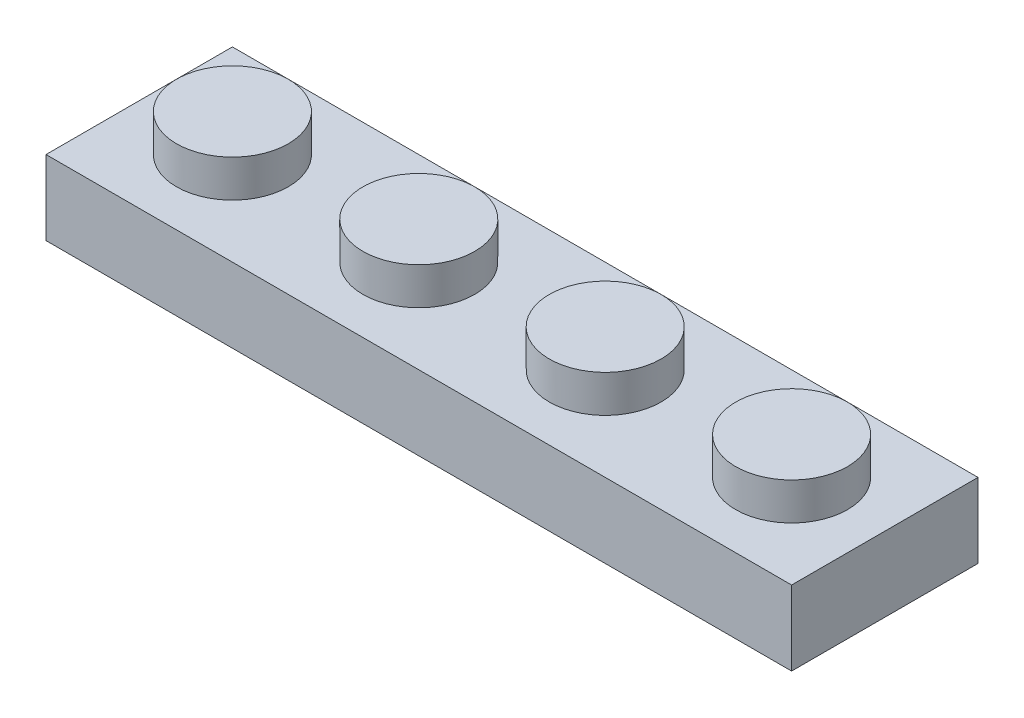
ISO-10303-21;
HEADER;
FILE_DESCRIPTION(('STEP AP214'),'2;1');
FILE_NAME('part.step','',(''),(''),'','','');
FILE_SCHEMA(('AUTOMOTIVE_DESIGN { 1 0 10303 214 1 1 1 1 }'));
ENDSEC;
DATA;
#1=APPLICATION_CONTEXT('core data for automotive mechanical design processes');
#2=APPLICATION_PROTOCOL_DEFINITION('international standard','automotive_design',2000,#1);
#3=PRODUCT_CONTEXT('',#1,'mechanical');
#4=PRODUCT('Part','Part','',(#3));
#5=PRODUCT_RELATED_PRODUCT_CATEGORY('part','',(#4));
#6=PRODUCT_DEFINITION_FORMATION('','',#4);
#7=PRODUCT_DEFINITION_CONTEXT('part definition',#1,'design');
#8=PRODUCT_DEFINITION('design','',#6,#7);
#9=PRODUCT_DEFINITION_SHAPE('','',#8);
#10=(LENGTH_UNIT() NAMED_UNIT(*) SI_UNIT(.MILLI.,.METRE.));
#11=(NAMED_UNIT(*) PLANE_ANGLE_UNIT() SI_UNIT($,.RADIAN.));
#12=(NAMED_UNIT(*) SI_UNIT($,.STERADIAN.) SOLID_ANGLE_UNIT());
#13=UNCERTAINTY_MEASURE_WITH_UNIT(LENGTH_MEASURE(1.E-05),#10,'distance_accuracy_value','');
#14=(GEOMETRIC_REPRESENTATION_CONTEXT(3) GLOBAL_UNCERTAINTY_ASSIGNED_CONTEXT((#13)) GLOBAL_UNIT_ASSIGNED_CONTEXT((#10,
#11,#12)) REPRESENTATION_CONTEXT('',''));
#15=CARTESIAN_POINT('',(0.,0.,0.));
#16=DIRECTION('',(0.,0.,1.));
#17=DIRECTION('',(1.,0.,0.));
#18=AXIS2_PLACEMENT_3D('',#15,#16,#17);
#19=CARTESIAN_POINT('',(28.,1.6,0.));
#20=DIRECTION('',(-1.,0.,0.));
#21=DIRECTION('',(0.,0.,1.));
#22=AXIS2_PLACEMENT_3D('',#19,#20,#21);
#23=PLANE('',#22);
#24=DIRECTION('',(0.,0.,-1.));
#25=VECTOR('',#24,1.);
#26=CARTESIAN_POINT('',(28.,0.,0.));
#27=LINE('',#26,#25);
#28=CARTESIAN_POINT('',(28.,0.,4.));
#29=VERTEX_POINT('',#28);
#30=CARTESIAN_POINT('',(28.,0.,-4.));
#31=VERTEX_POINT('',#30);
#32=EDGE_CURVE('E143',#29,#31,#27,.T.);
#33=ORIENTED_EDGE('',*,*,#32,.T.);
#34=DIRECTION('',(0.,-1.,0.));
#35=VECTOR('',#34,1.);
#36=CARTESIAN_POINT('',(28.,1.6,-4.));
#37=LINE('',#36,#35);
#38=CARTESIAN_POINT('',(28.,3.2,-4.));
#39=VERTEX_POINT('',#38);
#40=EDGE_CURVE('E137',#39,#31,#37,.T.);
#41=ORIENTED_EDGE('',*,*,#40,.F.);
#42=DIRECTION('',(0.,0.,-1.));
#43=VECTOR('',#42,1.);
#44=CARTESIAN_POINT('',(28.,3.2,0.));
#45=LINE('',#44,#43);
#46=CARTESIAN_POINT('',(28.,3.2,4.));
#47=VERTEX_POINT('',#46);
#48=EDGE_CURVE('E10',#47,#39,#45,.T.);
#49=ORIENTED_EDGE('',*,*,#48,.F.);
#50=DIRECTION('',(0.,1.,0.));
#51=VECTOR('',#50,1.);
#52=CARTESIAN_POINT('',(28.,1.6,4.));
#53=LINE('',#52,#51);
#54=EDGE_CURVE('E132',#29,#47,#53,.T.);
#55=ORIENTED_EDGE('',*,*,#54,.F.);
#56=EDGE_LOOP('',(#33,#41,#49,#55));
#57=FACE_BOUND('',#56,.T.);
#58=ADVANCED_FACE('F16',(#57),#23,.F.);
#59=CARTESIAN_POINT('',(12.,3.2,0.));
#60=DIRECTION('',(0.,-1.,0.));
#61=DIRECTION('',(0.,0.,-1.));
#62=AXIS2_PLACEMENT_3D('',#59,#60,#61);
#63=PLANE('',#62);
#64=ORIENTED_EDGE('',*,*,#48,.T.);
#65=DIRECTION('',(1.,0.,0.));
#66=VECTOR('',#65,1.);
#67=CARTESIAN_POINT('',(12.,3.2,-4.));
#68=LINE('',#67,#66);
#69=CARTESIAN_POINT('',(-4.,3.2,-4.));
#70=VERTEX_POINT('',#69);
#71=EDGE_CURVE('E127',#70,#39,#68,.T.);
#72=ORIENTED_EDGE('',*,*,#71,.F.);
#73=DIRECTION('',(0.,0.,-1.));
#74=VECTOR('',#73,1.);
#75=CARTESIAN_POINT('',(-4.,3.2,0.));
#76=LINE('',#75,#74);
#77=CARTESIAN_POINT('',(-4.,3.2,4.));
#78=VERTEX_POINT('',#77);
#79=EDGE_CURVE('E26',#78,#70,#76,.T.);
#80=ORIENTED_EDGE('',*,*,#79,.F.);
#81=DIRECTION('',(-1.,0.,0.));
#82=VECTOR('',#81,1.);
#83=CARTESIAN_POINT('',(12.,3.2,4.));
#84=LINE('',#83,#82);
#85=EDGE_CURVE('E172',#47,#78,#84,.T.);
#86=ORIENTED_EDGE('',*,*,#85,.F.);
#87=EDGE_LOOP('',(#64,#72,#80,#86));
#88=FACE_BOUND('',#87,.T.);
#89=CARTESIAN_POINT('',(0.,3.2,0.));
#90=DIRECTION('',(0.,-1.,0.));
#91=DIRECTION('',(1.,0.,0.));
#92=AXIS2_PLACEMENT_3D('',#89,#90,#91);
#93=CIRCLE('',#92,2.4);
#94=CARTESIAN_POINT('',(-2.4,3.2,0.));
#95=VERTEX_POINT('',#94);
#96=EDGE_CURVE('E129',#95,#95,#93,.T.);
#97=ORIENTED_EDGE('',*,*,#96,.T.);
#98=EDGE_LOOP('',(#97));
#99=FACE_BOUND('',#98,.T.);
#100=CARTESIAN_POINT('',(8.,3.2,0.));
#101=DIRECTION('',(0.,-1.,0.));
#102=DIRECTION('',(1.,0.,0.));
#103=AXIS2_PLACEMENT_3D('',#100,#101,#102);
#104=CIRCLE('',#103,2.4);
#105=CARTESIAN_POINT('',(5.6,3.2,0.));
#106=VERTEX_POINT('',#105);
#107=EDGE_CURVE('E48',#106,#106,#104,.T.);
#108=ORIENTED_EDGE('',*,*,#107,.T.);
#109=EDGE_LOOP('',(#108));
#110=FACE_BOUND('',#109,.T.);
#111=CARTESIAN_POINT('',(16.,3.2,0.));
#112=DIRECTION('',(0.,-1.,0.));
#113=DIRECTION('',(1.,0.,0.));
#114=AXIS2_PLACEMENT_3D('',#111,#112,#113);
#115=CIRCLE('',#114,2.4);
#116=CARTESIAN_POINT('',(13.6,3.2,0.));
#117=VERTEX_POINT('',#116);
#118=EDGE_CURVE('E144',#117,#117,#115,.T.);
#119=ORIENTED_EDGE('',*,*,#118,.T.);
#120=EDGE_LOOP('',(#119));
#121=FACE_BOUND('',#120,.T.);
#122=CARTESIAN_POINT('',(24.,3.2,0.));
#123=DIRECTION('',(0.,-1.,0.));
#124=DIRECTION('',(1.,0.,0.));
#125=AXIS2_PLACEMENT_3D('',#122,#123,#124);
#126=CIRCLE('',#125,2.4);
#127=CARTESIAN_POINT('',(21.6,3.2,0.));
#128=VERTEX_POINT('',#127);
#129=EDGE_CURVE('E150',#128,#128,#126,.T.);
#130=ORIENTED_EDGE('',*,*,#129,.T.);
#131=EDGE_LOOP('',(#130));
#132=FACE_BOUND('',#131,.T.);
#133=ADVANCED_FACE('F209',(#88,#99,#110,#121,#132),#63,.F.);
#134=CARTESIAN_POINT('',(-4.,1.6,0.));
#135=DIRECTION('',(1.,0.,0.));
#136=DIRECTION('',(0.,0.,-1.));
#137=AXIS2_PLACEMENT_3D('',#134,#135,#136);
#138=PLANE('',#137);
#139=ORIENTED_EDGE('',*,*,#79,.T.);
#140=DIRECTION('',(0.,1.,0.));
#141=VECTOR('',#140,1.);
#142=CARTESIAN_POINT('',(-4.,1.6,-4.));
#143=LINE('',#142,#141);
#144=CARTESIAN_POINT('',(-4.,0.,-4.));
#145=VERTEX_POINT('',#144);
#146=EDGE_CURVE('E124',#145,#70,#143,.T.);
#147=ORIENTED_EDGE('',*,*,#146,.F.);
#148=DIRECTION('',(0.,0.,-1.));
#149=VECTOR('',#148,1.);
#150=CARTESIAN_POINT('',(-4.,0.,0.));
#151=LINE('',#150,#149);
#152=CARTESIAN_POINT('',(-4.,0.,4.));
#153=VERTEX_POINT('',#152);
#154=EDGE_CURVE('E142',#153,#145,#151,.T.);
#155=ORIENTED_EDGE('',*,*,#154,.F.);
#156=DIRECTION('',(0.,-1.,0.));
#157=VECTOR('',#156,1.);
#158=CARTESIAN_POINT('',(-4.,1.6,4.));
#159=LINE('',#158,#157);
#160=EDGE_CURVE('E167',#78,#153,#159,.T.);
#161=ORIENTED_EDGE('',*,*,#160,.F.);
#162=EDGE_LOOP('',(#139,#147,#155,#161));
#163=FACE_BOUND('',#162,.T.);
#164=ADVANCED_FACE('F214',(#163),#138,.F.);
#165=CARTESIAN_POINT('',(12.,0.,0.));
#166=DIRECTION('',(0.,1.,0.));
#167=DIRECTION('',(0.,0.,1.));
#168=AXIS2_PLACEMENT_3D('',#165,#166,#167);
#169=PLANE('',#168);
#170=ORIENTED_EDGE('',*,*,#154,.T.);
#171=DIRECTION('',(-1.,0.,0.));
#172=VECTOR('',#171,1.);
#173=CARTESIAN_POINT('',(12.,0.,-4.));
#174=LINE('',#173,#172);
#175=EDGE_CURVE('E128',#31,#145,#174,.T.);
#176=ORIENTED_EDGE('',*,*,#175,.F.);
#177=ORIENTED_EDGE('',*,*,#32,.F.);
#178=DIRECTION('',(1.,0.,0.));
#179=VECTOR('',#178,1.);
#180=CARTESIAN_POINT('',(12.,0.,4.));
#181=LINE('',#180,#179);
#182=EDGE_CURVE('E164',#153,#29,#181,.T.);
#183=ORIENTED_EDGE('',*,*,#182,.F.);
#184=EDGE_LOOP('',(#170,#176,#177,#183));
#185=FACE_BOUND('',#184,.T.);
#186=CARTESIAN_POINT('',(0.,0.,0.));
#187=DIRECTION('',(0.,1.,0.));
#188=DIRECTION('',(1.,0.,0.));
#189=AXIS2_PLACEMENT_3D('',#186,#187,#188);
#190=CIRCLE('',#189,2.4);
#191=CARTESIAN_POINT('',(-2.4,0.,0.));
#192=VERTEX_POINT('',#191);
#193=EDGE_CURVE('E20',#192,#192,#190,.T.);
#194=ORIENTED_EDGE('',*,*,#193,.T.);
#195=EDGE_LOOP('',(#194));
#196=FACE_BOUND('',#195,.T.);
#197=CARTESIAN_POINT('',(8.,0.,0.));
#198=DIRECTION('',(0.,1.,0.));
#199=DIRECTION('',(1.,0.,0.));
#200=AXIS2_PLACEMENT_3D('',#197,#198,#199);
#201=CIRCLE('',#200,2.4);
#202=CARTESIAN_POINT('',(5.6,0.,0.));
#203=VERTEX_POINT('',#202);
#204=EDGE_CURVE('E123',#203,#203,#201,.T.);
#205=ORIENTED_EDGE('',*,*,#204,.T.);
#206=EDGE_LOOP('',(#205));
#207=FACE_BOUND('',#206,.T.);
#208=CARTESIAN_POINT('',(16.,0.,0.));
#209=DIRECTION('',(0.,1.,0.));
#210=DIRECTION('',(1.,0.,0.));
#211=AXIS2_PLACEMENT_3D('',#208,#209,#210);
#212=CIRCLE('',#211,2.4);
#213=CARTESIAN_POINT('',(13.6,0.,0.));
#214=VERTEX_POINT('',#213);
#215=EDGE_CURVE('E104',#214,#214,#212,.T.);
#216=ORIENTED_EDGE('',*,*,#215,.T.);
#217=EDGE_LOOP('',(#216));
#218=FACE_BOUND('',#217,.T.);
#219=CARTESIAN_POINT('',(24.,0.,0.));
#220=DIRECTION('',(0.,1.,0.));
#221=DIRECTION('',(1.,0.,0.));
#222=AXIS2_PLACEMENT_3D('',#219,#220,#221);
#223=CIRCLE('',#222,2.4);
#224=CARTESIAN_POINT('',(21.6,0.,0.));
#225=VERTEX_POINT('',#224);
#226=EDGE_CURVE('E114',#225,#225,#223,.T.);
#227=ORIENTED_EDGE('',*,*,#226,.T.);
#228=EDGE_LOOP('',(#227));
#229=FACE_BOUND('',#228,.T.);
#230=ADVANCED_FACE('F115',(#185,#196,#207,#218,#229),#169,.F.);
#231=CARTESIAN_POINT('',(12.,1.6,-4.));
#232=DIRECTION('',(0.,0.,1.));
#233=DIRECTION('',(1.,0.,0.));
#234=AXIS2_PLACEMENT_3D('',#231,#232,#233);
#235=PLANE('',#234);
#236=ORIENTED_EDGE('',*,*,#40,.T.);
#237=ORIENTED_EDGE('',*,*,#175,.T.);
#238=ORIENTED_EDGE('',*,*,#146,.T.);
#239=ORIENTED_EDGE('',*,*,#71,.T.);
#240=EDGE_LOOP('',(#236,#237,#238,#239));
#241=FACE_BOUND('',#240,.T.);
#242=ADVANCED_FACE('F161',(#241),#235,.F.);
#243=CARTESIAN_POINT('',(12.,1.6,4.));
#244=DIRECTION('',(0.,0.,1.));
#245=DIRECTION('',(1.,0.,0.));
#246=AXIS2_PLACEMENT_3D('',#243,#244,#245);
#247=PLANE('',#246);
#248=ORIENTED_EDGE('',*,*,#54,.T.);
#249=ORIENTED_EDGE('',*,*,#85,.T.);
#250=ORIENTED_EDGE('',*,*,#160,.T.);
#251=ORIENTED_EDGE('',*,*,#182,.T.);
#252=EDGE_LOOP('',(#248,#249,#250,#251));
#253=FACE_BOUND('',#252,.T.);
#254=ADVANCED_FACE('F228',(#253),#247,.T.);
#255=CARTESIAN_POINT('',(0.,4.8,0.));
#256=DIRECTION('',(0.,1.,0.));
#257=DIRECTION('',(1.,0.,0.));
#258=AXIS2_PLACEMENT_3D('',#255,#256,#257);
#259=PLANE('',#258);
#260=CARTESIAN_POINT('',(0.,4.8,0.));
#261=DIRECTION('',(0.,1.,0.));
#262=DIRECTION('',(1.,0.,0.));
#263=AXIS2_PLACEMENT_3D('',#260,#261,#262);
#264=CIRCLE('',#263,2.4);
#265=CARTESIAN_POINT('',(2.4,4.8,0.));
#266=VERTEX_POINT('',#265);
#267=EDGE_CURVE('E133',#266,#266,#264,.T.);
#268=ORIENTED_EDGE('',*,*,#267,.T.);
#269=EDGE_LOOP('',(#268));
#270=FACE_BOUND('',#269,.T.);
#271=ADVANCED_FACE('F224',(#270),#259,.T.);
#272=CARTESIAN_POINT('',(0.,3.75,0.));
#273=DIRECTION('',(0.,-1.,0.));
#274=DIRECTION('',(1.,0.,0.));
#275=AXIS2_PLACEMENT_3D('',#272,#273,#274);
#276=CYLINDRICAL_SURFACE('',#275,2.4);
#277=ORIENTED_EDGE('',*,*,#96,.F.);
#278=EDGE_LOOP('',(#277));
#279=FACE_BOUND('',#278,.T.);
#280=ORIENTED_EDGE('',*,*,#267,.F.);
#281=EDGE_LOOP('',(#280));
#282=FACE_BOUND('',#281,.T.);
#283=ADVANCED_FACE('F227',(#279,#282),#276,.T.);
#284=CARTESIAN_POINT('',(8.,4.8,0.));
#285=DIRECTION('',(0.,1.,0.));
#286=DIRECTION('',(1.,0.,0.));
#287=AXIS2_PLACEMENT_3D('',#284,#285,#286);
#288=PLANE('',#287);
#289=CARTESIAN_POINT('',(8.,4.8,0.));
#290=DIRECTION('',(0.,1.,0.));
#291=DIRECTION('',(1.,0.,0.));
#292=AXIS2_PLACEMENT_3D('',#289,#290,#291);
#293=CIRCLE('',#292,2.4);
#294=CARTESIAN_POINT('',(10.4,4.8,0.));
#295=VERTEX_POINT('',#294);
#296=EDGE_CURVE('E56',#295,#295,#293,.T.);
#297=ORIENTED_EDGE('',*,*,#296,.T.);
#298=EDGE_LOOP('',(#297));
#299=FACE_BOUND('',#298,.T.);
#300=ADVANCED_FACE('F236',(#299),#288,.T.);
#301=CARTESIAN_POINT('',(8.,3.75,0.));
#302=DIRECTION('',(0.,-1.,0.));
#303=DIRECTION('',(1.,0.,0.));
#304=AXIS2_PLACEMENT_3D('',#301,#302,#303);
#305=CYLINDRICAL_SURFACE('',#304,2.4);
#306=ORIENTED_EDGE('',*,*,#107,.F.);
#307=EDGE_LOOP('',(#306));
#308=FACE_BOUND('',#307,.T.);
#309=ORIENTED_EDGE('',*,*,#296,.F.);
#310=EDGE_LOOP('',(#309));
#311=FACE_BOUND('',#310,.T.);
#312=ADVANCED_FACE('F18',(#308,#311),#305,.T.);
#313=CARTESIAN_POINT('',(16.,4.8,0.));
#314=DIRECTION('',(0.,1.,0.));
#315=DIRECTION('',(1.,0.,0.));
#316=AXIS2_PLACEMENT_3D('',#313,#314,#315);
#317=PLANE('',#316);
#318=CARTESIAN_POINT('',(16.,4.8,0.));
#319=DIRECTION('',(0.,1.,0.));
#320=DIRECTION('',(1.,0.,0.));
#321=AXIS2_PLACEMENT_3D('',#318,#319,#320);
#322=CIRCLE('',#321,2.4);
#323=CARTESIAN_POINT('',(18.4,4.8,0.));
#324=VERTEX_POINT('',#323);
#325=EDGE_CURVE('E145',#324,#324,#322,.T.);
#326=ORIENTED_EDGE('',*,*,#325,.T.);
#327=EDGE_LOOP('',(#326));
#328=FACE_BOUND('',#327,.T.);
#329=ADVANCED_FACE('F222',(#328),#317,.T.);
#330=CARTESIAN_POINT('',(16.,3.75,0.));
#331=DIRECTION('',(0.,-1.,0.));
#332=DIRECTION('',(1.,0.,0.));
#333=AXIS2_PLACEMENT_3D('',#330,#331,#332);
#334=CYLINDRICAL_SURFACE('',#333,2.4);
#335=ORIENTED_EDGE('',*,*,#118,.F.);
#336=EDGE_LOOP('',(#335));
#337=FACE_BOUND('',#336,.T.);
#338=ORIENTED_EDGE('',*,*,#325,.F.);
#339=EDGE_LOOP('',(#338));
#340=FACE_BOUND('',#339,.T.);
#341=ADVANCED_FACE('F218',(#337,#340),#334,.T.);
#342=CARTESIAN_POINT('',(24.,4.8,0.));
#343=DIRECTION('',(0.,1.,0.));
#344=DIRECTION('',(1.,0.,0.));
#345=AXIS2_PLACEMENT_3D('',#342,#343,#344);
#346=PLANE('',#345);
#347=CARTESIAN_POINT('',(24.,4.8,0.));
#348=DIRECTION('',(0.,1.,0.));
#349=DIRECTION('',(1.,0.,0.));
#350=AXIS2_PLACEMENT_3D('',#347,#348,#349);
#351=CIRCLE('',#350,2.4);
#352=CARTESIAN_POINT('',(26.4,4.8,0.));
#353=VERTEX_POINT('',#352);
#354=EDGE_CURVE('E141',#353,#353,#351,.T.);
#355=ORIENTED_EDGE('',*,*,#354,.T.);
#356=EDGE_LOOP('',(#355));
#357=FACE_BOUND('',#356,.T.);
#358=ADVANCED_FACE('F221',(#357),#346,.T.);
#359=CARTESIAN_POINT('',(24.,3.75,0.));
#360=DIRECTION('',(0.,-1.,0.));
#361=DIRECTION('',(1.,0.,0.));
#362=AXIS2_PLACEMENT_3D('',#359,#360,#361);
#363=CYLINDRICAL_SURFACE('',#362,2.4);
#364=ORIENTED_EDGE('',*,*,#129,.F.);
#365=EDGE_LOOP('',(#364));
#366=FACE_BOUND('',#365,.T.);
#367=ORIENTED_EDGE('',*,*,#354,.F.);
#368=EDGE_LOOP('',(#367));
#369=FACE_BOUND('',#368,.T.);
#370=ADVANCED_FACE('F203',(#366,#369),#363,.T.);
#371=CARTESIAN_POINT('',(0.,1.6,0.));
#372=DIRECTION('',(0.,1.,0.));
#373=DIRECTION('',(1.,0.,0.));
#374=AXIS2_PLACEMENT_3D('',#371,#372,#373);
#375=PLANE('',#374);
#376=CARTESIAN_POINT('',(0.,1.6,0.));
#377=DIRECTION('',(0.,1.,0.));
#378=DIRECTION('',(1.,0.,0.));
#379=AXIS2_PLACEMENT_3D('',#376,#377,#378);
#380=CIRCLE('',#379,2.4);
#381=CARTESIAN_POINT('',(2.4,1.6,0.));
#382=VERTEX_POINT('',#381);
#383=EDGE_CURVE('E138',#382,#382,#380,.T.);
#384=ORIENTED_EDGE('',*,*,#383,.F.);
#385=EDGE_LOOP('',(#384));
#386=FACE_BOUND('',#385,.T.);
#387=ADVANCED_FACE('F192',(#386),#375,.F.);
#388=CARTESIAN_POINT('',(0.,0.55,0.));
#389=DIRECTION('',(0.,-1.,0.));
#390=DIRECTION('',(1.,0.,0.));
#391=AXIS2_PLACEMENT_3D('',#388,#389,#390);
#392=CYLINDRICAL_SURFACE('',#391,2.4);
#393=ORIENTED_EDGE('',*,*,#383,.T.);
#394=EDGE_LOOP('',(#393));
#395=FACE_BOUND('',#394,.T.);
#396=ORIENTED_EDGE('',*,*,#193,.F.);
#397=EDGE_LOOP('',(#396));
#398=FACE_BOUND('',#397,.T.);
#399=ADVANCED_FACE('F189',(#395,#398),#392,.F.);
#400=CARTESIAN_POINT('',(8.,1.6,0.));
#401=DIRECTION('',(0.,1.,0.));
#402=DIRECTION('',(1.,0.,0.));
#403=AXIS2_PLACEMENT_3D('',#400,#401,#402);
#404=PLANE('',#403);
#405=CARTESIAN_POINT('',(8.,1.6,0.));
#406=DIRECTION('',(0.,1.,0.));
#407=DIRECTION('',(1.,0.,0.));
#408=AXIS2_PLACEMENT_3D('',#405,#406,#407);
#409=CIRCLE('',#408,2.4);
#410=CARTESIAN_POINT('',(10.4,1.6,0.));
#411=VERTEX_POINT('',#410);
#412=EDGE_CURVE('E180',#411,#411,#409,.T.);
#413=ORIENTED_EDGE('',*,*,#412,.F.);
#414=EDGE_LOOP('',(#413));
#415=FACE_BOUND('',#414,.T.);
#416=ADVANCED_FACE('F191',(#415),#404,.F.);
#417=CARTESIAN_POINT('',(8.,0.55,0.));
#418=DIRECTION('',(0.,-1.,0.));
#419=DIRECTION('',(1.,0.,0.));
#420=AXIS2_PLACEMENT_3D('',#417,#418,#419);
#421=CYLINDRICAL_SURFACE('',#420,2.4);
#422=ORIENTED_EDGE('',*,*,#412,.T.);
#423=EDGE_LOOP('',(#422));
#424=FACE_BOUND('',#423,.T.);
#425=ORIENTED_EDGE('',*,*,#204,.F.);
#426=EDGE_LOOP('',(#425));
#427=FACE_BOUND('',#426,.T.);
#428=ADVANCED_FACE('F200',(#424,#427),#421,.F.);
#429=CARTESIAN_POINT('',(16.,1.6,0.));
#430=DIRECTION('',(0.,1.,0.));
#431=DIRECTION('',(1.,0.,0.));
#432=AXIS2_PLACEMENT_3D('',#429,#430,#431);
#433=PLANE('',#432);
#434=CARTESIAN_POINT('',(16.,1.6,0.));
#435=DIRECTION('',(0.,1.,0.));
#436=DIRECTION('',(1.,0.,0.));
#437=AXIS2_PLACEMENT_3D('',#434,#435,#436);
#438=CIRCLE('',#437,2.4);
#439=CARTESIAN_POINT('',(18.4,1.6,0.));
#440=VERTEX_POINT('',#439);
#441=EDGE_CURVE('E121',#440,#440,#438,.T.);
#442=ORIENTED_EDGE('',*,*,#441,.F.);
#443=EDGE_LOOP('',(#442));
#444=FACE_BOUND('',#443,.T.);
#445=ADVANCED_FACE('F217',(#444),#433,.F.);
#446=CARTESIAN_POINT('',(16.,0.55,0.));
#447=DIRECTION('',(0.,-1.,0.));
#448=DIRECTION('',(1.,0.,0.));
#449=AXIS2_PLACEMENT_3D('',#446,#447,#448);
#450=CYLINDRICAL_SURFACE('',#449,2.4);
#451=ORIENTED_EDGE('',*,*,#441,.T.);
#452=EDGE_LOOP('',(#451));
#453=FACE_BOUND('',#452,.T.);
#454=ORIENTED_EDGE('',*,*,#215,.F.);
#455=EDGE_LOOP('',(#454));
#456=FACE_BOUND('',#455,.T.);
#457=ADVANCED_FACE('F239',(#453,#456),#450,.F.);
#458=CARTESIAN_POINT('',(24.,1.6,0.));
#459=DIRECTION('',(0.,1.,0.));
#460=DIRECTION('',(1.,0.,0.));
#461=AXIS2_PLACEMENT_3D('',#458,#459,#460);
#462=PLANE('',#461);
#463=CARTESIAN_POINT('',(24.,1.6,0.));
#464=DIRECTION('',(0.,1.,0.));
#465=DIRECTION('',(1.,0.,0.));
#466=AXIS2_PLACEMENT_3D('',#463,#464,#465);
#467=CIRCLE('',#466,2.4);
#468=CARTESIAN_POINT('',(26.4,1.6,0.));
#469=VERTEX_POINT('',#468);
#470=EDGE_CURVE('E109',#469,#469,#467,.T.);
#471=ORIENTED_EDGE('',*,*,#470,.F.);
#472=EDGE_LOOP('',(#471));
#473=FACE_BOUND('',#472,.T.);
#474=ADVANCED_FACE('F242',(#473),#462,.F.);
#475=CARTESIAN_POINT('',(24.,0.55,0.));
#476=DIRECTION('',(0.,-1.,0.));
#477=DIRECTION('',(1.,0.,0.));
#478=AXIS2_PLACEMENT_3D('',#475,#476,#477);
#479=CYLINDRICAL_SURFACE('',#478,2.4);
#480=ORIENTED_EDGE('',*,*,#470,.T.);
#481=EDGE_LOOP('',(#480));
#482=FACE_BOUND('',#481,.T.);
#483=ORIENTED_EDGE('',*,*,#226,.F.);
#484=EDGE_LOOP('',(#483));
#485=FACE_BOUND('',#484,.T.);
#486=ADVANCED_FACE('F353',(#482,#485),#479,.F.);
#487=CLOSED_SHELL('',(#58,#133,#164,#230,#242,#254,#271,#283,#300,#312,#329,#341,#358,#370,#387,
#399,#416,#428,#445,#457,#474,#486));
#488=MANIFOLD_SOLID_BREP('B1',#487);
#489=ADVANCED_BREP_SHAPE_REPRESENTATION('',(#18,#488),#14);
#490=SHAPE_DEFINITION_REPRESENTATION(#9,#489);
ENDSEC;
END-ISO-10303-21;
